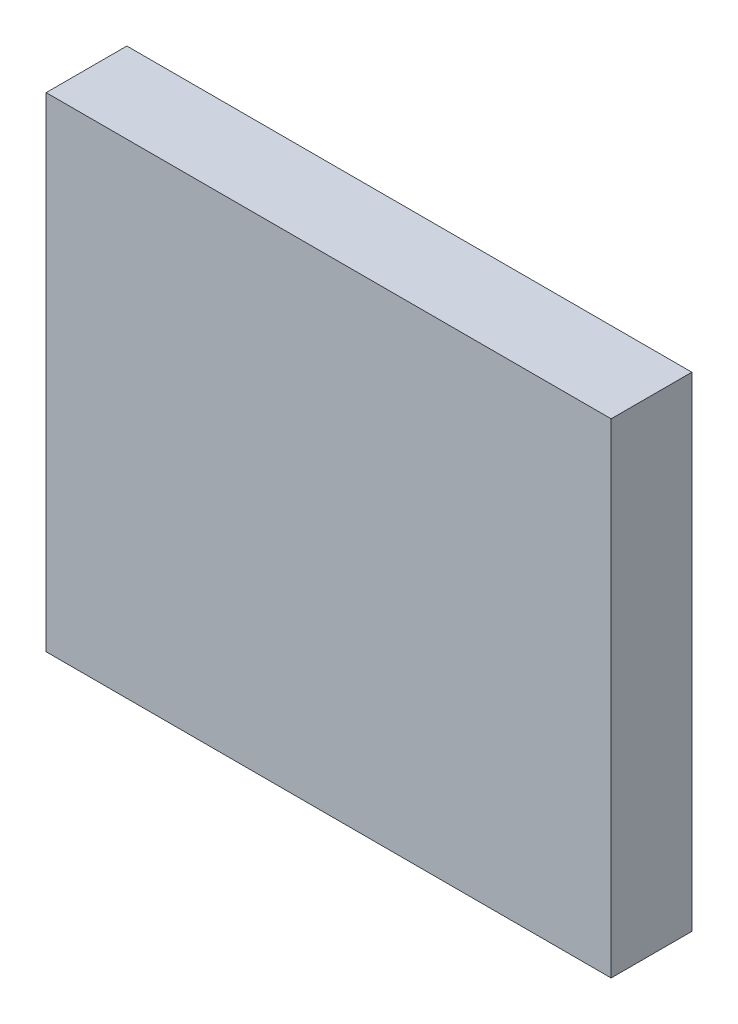
ISO-10303-21;
HEADER;
FILE_DESCRIPTION(('STEP AP214'),'2;1');
FILE_NAME('part.step','',(''),(''),'','','');
FILE_SCHEMA(('AUTOMOTIVE_DESIGN { 1 0 10303 214 1 1 1 1 }'));
ENDSEC;
DATA;
#1=APPLICATION_CONTEXT('core data for automotive mechanical design processes');
#2=APPLICATION_PROTOCOL_DEFINITION('international standard','automotive_design',2000,#1);
#3=PRODUCT_CONTEXT('',#1,'mechanical');
#4=PRODUCT('Part','Part','',(#3));
#5=PRODUCT_RELATED_PRODUCT_CATEGORY('part','',(#4));
#6=PRODUCT_DEFINITION_FORMATION('','',#4);
#7=PRODUCT_DEFINITION_CONTEXT('part definition',#1,'design');
#8=PRODUCT_DEFINITION('design','',#6,#7);
#9=PRODUCT_DEFINITION_SHAPE('','',#8);
#10=(LENGTH_UNIT() NAMED_UNIT(*) SI_UNIT(.MILLI.,.METRE.));
#11=(NAMED_UNIT(*) PLANE_ANGLE_UNIT() SI_UNIT($,.RADIAN.));
#12=(NAMED_UNIT(*) SI_UNIT($,.STERADIAN.) SOLID_ANGLE_UNIT());
#13=UNCERTAINTY_MEASURE_WITH_UNIT(LENGTH_MEASURE(1.E-05),#10,'distance_accuracy_value','');
#14=(GEOMETRIC_REPRESENTATION_CONTEXT(3) GLOBAL_UNCERTAINTY_ASSIGNED_CONTEXT((#13)) GLOBAL_UNIT_ASSIGNED_CONTEXT((#10,
#11,#12)) REPRESENTATION_CONTEXT('',''));
#15=CARTESIAN_POINT('',(0.,0.,0.));
#16=DIRECTION('',(0.,0.,1.));
#17=DIRECTION('',(1.,0.,0.));
#18=AXIS2_PLACEMENT_3D('',#15,#16,#17);
#19=CARTESIAN_POINT('',(-22.4630985915493,43.6808450704225,10.));
#20=DIRECTION('',(1.,0.,0.));
#21=DIRECTION('',(0.,1.,0.));
#22=AXIS2_PLACEMENT_3D('',#19,#20,#21);
#23=PLANE('',#22);
#24=DIRECTION('',(0.,-1.,0.));
#25=VECTOR('',#24,1.);
#26=CARTESIAN_POINT('',(-22.4630985915493,43.6808450704225,0.));
#27=LINE('',#26,#25);
#28=CARTESIAN_POINT('',(-22.4630985915493,43.6808450704225,0.));
#29=VERTEX_POINT('',#28);
#30=CARTESIAN_POINT('',(-22.4630985915493,-16.3191549295775,0.));
#31=VERTEX_POINT('',#30);
#32=EDGE_CURVE('E74',#29,#31,#27,.T.);
#33=ORIENTED_EDGE('',*,*,#32,.T.);
#34=DIRECTION('',(0.,0.,-1.));
#35=VECTOR('',#34,1.);
#36=CARTESIAN_POINT('',(-22.4630985915493,-16.3191549295775,10.));
#37=LINE('',#36,#35);
#38=CARTESIAN_POINT('',(-22.4630985915493,-16.3191549295775,10.));
#39=VERTEX_POINT('',#38);
#40=EDGE_CURVE('E11',#39,#31,#37,.T.);
#41=ORIENTED_EDGE('',*,*,#40,.F.);
#42=DIRECTION('',(0.,-1.,0.));
#43=VECTOR('',#42,1.);
#44=CARTESIAN_POINT('',(-22.4630985915493,43.6808450704225,10.));
#45=LINE('',#44,#43);
#46=CARTESIAN_POINT('',(-22.4630985915493,43.6808450704225,10.));
#47=VERTEX_POINT('',#46);
#48=EDGE_CURVE('E92',#47,#39,#45,.T.);
#49=ORIENTED_EDGE('',*,*,#48,.F.);
#50=DIRECTION('',(0.,0.,-1.));
#51=VECTOR('',#50,1.);
#52=CARTESIAN_POINT('',(-22.4630985915493,43.6808450704225,10.));
#53=LINE('',#52,#51);
#54=EDGE_CURVE('E86',#47,#29,#53,.T.);
#55=ORIENTED_EDGE('',*,*,#54,.T.);
#56=EDGE_LOOP('',(#33,#41,#49,#55));
#57=FACE_BOUND('',#56,.T.);
#58=ADVANCED_FACE('F30',(#57),#23,.F.);
#59=CARTESIAN_POINT('',(-22.4630985915493,-16.3191549295775,10.));
#60=DIRECTION('',(0.,1.,0.));
#61=DIRECTION('',(0.,0.,1.));
#62=AXIS2_PLACEMENT_3D('',#59,#60,#61);
#63=PLANE('',#62);
#64=DIRECTION('',(1.,0.,0.));
#65=VECTOR('',#64,1.);
#66=CARTESIAN_POINT('',(-22.4630985915493,-16.3191549295775,0.));
#67=LINE('',#66,#65);
#68=CARTESIAN_POINT('',(47.5369014084507,-16.3191549295775,0.));
#69=VERTEX_POINT('',#68);
#70=EDGE_CURVE('E70',#31,#69,#67,.T.);
#71=ORIENTED_EDGE('',*,*,#70,.T.);
#72=DIRECTION('',(0.,0.,-1.));
#73=VECTOR('',#72,1.);
#74=CARTESIAN_POINT('',(47.5369014084507,-16.3191549295775,10.));
#75=LINE('',#74,#73);
#76=CARTESIAN_POINT('',(47.5369014084507,-16.3191549295775,10.));
#77=VERTEX_POINT('',#76);
#78=EDGE_CURVE('E37',#77,#69,#75,.T.);
#79=ORIENTED_EDGE('',*,*,#78,.F.);
#80=DIRECTION('',(1.,0.,0.));
#81=VECTOR('',#80,1.);
#82=CARTESIAN_POINT('',(-22.4630985915493,-16.3191549295775,10.));
#83=LINE('',#82,#81);
#84=EDGE_CURVE('E82',#39,#77,#83,.T.);
#85=ORIENTED_EDGE('',*,*,#84,.F.);
#86=ORIENTED_EDGE('',*,*,#40,.T.);
#87=EDGE_LOOP('',(#71,#79,#85,#86));
#88=FACE_BOUND('',#87,.T.);
#89=ADVANCED_FACE('F81',(#88),#63,.F.);
#90=CARTESIAN_POINT('',(47.5369014084507,43.6808450704225,10.));
#91=DIRECTION('',(-1.,0.,0.));
#92=DIRECTION('',(0.,0.,1.));
#93=AXIS2_PLACEMENT_3D('',#90,#91,#92);
#94=PLANE('',#93);
#95=DIRECTION('',(0.,1.,0.));
#96=VECTOR('',#95,1.);
#97=CARTESIAN_POINT('',(47.5369014084507,43.6808450704225,0.));
#98=LINE('',#97,#96);
#99=CARTESIAN_POINT('',(47.5369014084507,43.6808450704225,0.));
#100=VERTEX_POINT('',#99);
#101=EDGE_CURVE('E75',#69,#100,#98,.T.);
#102=ORIENTED_EDGE('',*,*,#101,.T.);
#103=DIRECTION('',(0.,0.,-1.));
#104=VECTOR('',#103,1.);
#105=CARTESIAN_POINT('',(47.5369014084507,43.6808450704225,10.));
#106=LINE('',#105,#104);
#107=CARTESIAN_POINT('',(47.5369014084507,43.6808450704225,10.));
#108=VERTEX_POINT('',#107);
#109=EDGE_CURVE('E98',#108,#100,#106,.T.);
#110=ORIENTED_EDGE('',*,*,#109,.F.);
#111=DIRECTION('',(0.,1.,0.));
#112=VECTOR('',#111,1.);
#113=CARTESIAN_POINT('',(47.5369014084507,43.6808450704225,10.));
#114=LINE('',#113,#112);
#115=EDGE_CURVE('E49',#77,#108,#114,.T.);
#116=ORIENTED_EDGE('',*,*,#115,.F.);
#117=ORIENTED_EDGE('',*,*,#78,.T.);
#118=EDGE_LOOP('',(#102,#110,#116,#117));
#119=FACE_BOUND('',#118,.T.);
#120=ADVANCED_FACE('F101',(#119),#94,.F.);
#121=CARTESIAN_POINT('',(-22.4630985915493,43.6808450704225,10.));
#122=DIRECTION('',(0.,-1.,0.));
#123=DIRECTION('',(0.,0.,-1.));
#124=AXIS2_PLACEMENT_3D('',#121,#122,#123);
#125=PLANE('',#124);
#126=DIRECTION('',(-1.,0.,0.));
#127=VECTOR('',#126,1.);
#128=CARTESIAN_POINT('',(-22.4630985915493,43.6808450704225,0.));
#129=LINE('',#128,#127);
#130=EDGE_CURVE('E90',#100,#29,#129,.T.);
#131=ORIENTED_EDGE('',*,*,#130,.T.);
#132=ORIENTED_EDGE('',*,*,#54,.F.);
#133=DIRECTION('',(-1.,0.,0.));
#134=VECTOR('',#133,1.);
#135=CARTESIAN_POINT('',(-22.4630985915493,43.6808450704225,10.));
#136=LINE('',#135,#134);
#137=EDGE_CURVE('E44',#108,#47,#136,.T.);
#138=ORIENTED_EDGE('',*,*,#137,.F.);
#139=ORIENTED_EDGE('',*,*,#109,.T.);
#140=EDGE_LOOP('',(#131,#132,#138,#139));
#141=FACE_BOUND('',#140,.T.);
#142=ADVANCED_FACE('F103',(#141),#125,.F.);
#143=CARTESIAN_POINT('',(-22.4630985915493,-16.3191549295775,10.));
#144=DIRECTION('',(0.,0.,1.));
#145=DIRECTION('',(1.,0.,0.));
#146=AXIS2_PLACEMENT_3D('',#143,#144,#145);
#147=PLANE('',#146);
#148=ORIENTED_EDGE('',*,*,#48,.T.);
#149=ORIENTED_EDGE('',*,*,#84,.T.);
#150=ORIENTED_EDGE('',*,*,#115,.T.);
#151=ORIENTED_EDGE('',*,*,#137,.T.);
#152=EDGE_LOOP('',(#148,#149,#150,#151));
#153=FACE_BOUND('',#152,.T.);
#154=ADVANCED_FACE('F104',(#153),#147,.T.);
#155=CARTESIAN_POINT('',(-22.4630985915493,-16.3191549295775,0.));
#156=DIRECTION('',(0.,0.,1.));
#157=DIRECTION('',(1.,0.,0.));
#158=AXIS2_PLACEMENT_3D('',#155,#156,#157);
#159=PLANE('',#158);
#160=ORIENTED_EDGE('',*,*,#32,.F.);
#161=ORIENTED_EDGE('',*,*,#130,.F.);
#162=ORIENTED_EDGE('',*,*,#101,.F.);
#163=ORIENTED_EDGE('',*,*,#70,.F.);
#164=EDGE_LOOP('',(#160,#161,#162,#163));
#165=FACE_BOUND('',#164,.T.);
#166=ADVANCED_FACE('F71',(#165),#159,.F.);
#167=CLOSED_SHELL('',(#58,#89,#120,#142,#154,#166));
#168=MANIFOLD_SOLID_BREP('B2',#167);
#169=ADVANCED_BREP_SHAPE_REPRESENTATION('',(#18,#168),#14);
#170=SHAPE_DEFINITION_REPRESENTATION(#9,#169);
ENDSEC;
END-ISO-10303-21;
